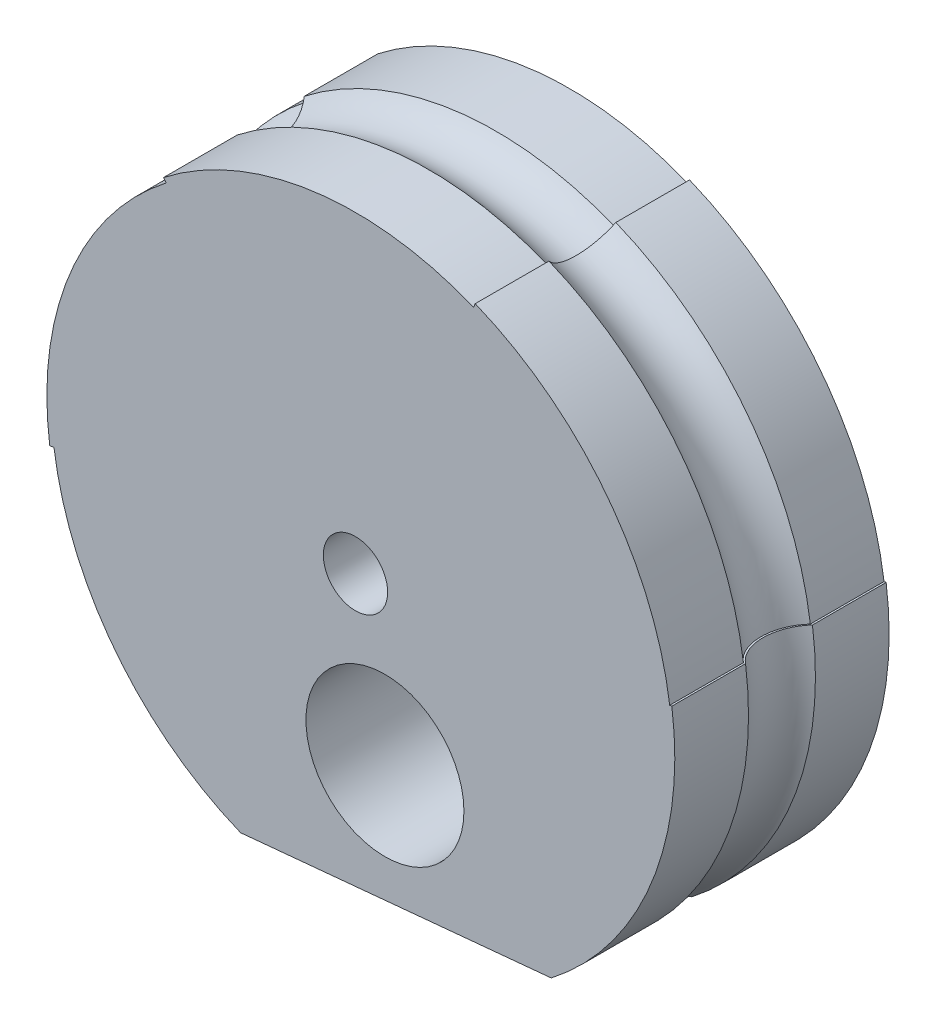
ISO-10303-21;
HEADER;
FILE_DESCRIPTION(('STEP AP214'),'2;1');
FILE_NAME('part.step','',(''),(''),'','','');
FILE_SCHEMA(('AUTOMOTIVE_DESIGN { 1 0 10303 214 1 1 1 1 }'));
ENDSEC;
DATA;
#1=APPLICATION_CONTEXT('core data for automotive mechanical design processes');
#2=APPLICATION_PROTOCOL_DEFINITION('international standard','automotive_design',2000,#1);
#3=PRODUCT_CONTEXT('',#1,'mechanical');
#4=PRODUCT('Part','Part','',(#3));
#5=PRODUCT_RELATED_PRODUCT_CATEGORY('part','',(#4));
#6=PRODUCT_DEFINITION_FORMATION('','',#4);
#7=PRODUCT_DEFINITION_CONTEXT('part definition',#1,'design');
#8=PRODUCT_DEFINITION('design','',#6,#7);
#9=PRODUCT_DEFINITION_SHAPE('','',#8);
#10=(LENGTH_UNIT() NAMED_UNIT(*) SI_UNIT(.MILLI.,.METRE.));
#11=(NAMED_UNIT(*) PLANE_ANGLE_UNIT() SI_UNIT($,.RADIAN.));
#12=(NAMED_UNIT(*) SI_UNIT($,.STERADIAN.) SOLID_ANGLE_UNIT());
#13=UNCERTAINTY_MEASURE_WITH_UNIT(LENGTH_MEASURE(1.E-05),#10,'distance_accuracy_value','');
#14=(GEOMETRIC_REPRESENTATION_CONTEXT(3) GLOBAL_UNCERTAINTY_ASSIGNED_CONTEXT((#13)) GLOBAL_UNIT_ASSIGNED_CONTEXT((#10,
#11,#12)) REPRESENTATION_CONTEXT('',''));
#15=CARTESIAN_POINT('',(0.,0.,0.));
#16=DIRECTION('',(0.,0.,1.));
#17=DIRECTION('',(1.,0.,0.));
#18=AXIS2_PLACEMENT_3D('',#15,#16,#17);
#19=CARTESIAN_POINT('',(54.8519790874451,15.7000000000002,-10.));
#20=DIRECTION('',(0.,0.,1.));
#21=DIRECTION('',(1.,0.,0.));
#22=AXIS2_PLACEMENT_3D('',#19,#20,#21);
#23=CYLINDRICAL_SURFACE('',#22,14.2);
#24=CARTESIAN_POINT('',(54.8519790874451,15.7000000000002,-6.56124949959959));
#25=DIRECTION('',(0.,0.,1.));
#26=DIRECTION('',(1.,0.,0.));
#27=AXIS2_PLACEMENT_3D('',#24,#25,#26);
#28=CIRCLE('',#27,14.2);
#29=CARTESIAN_POINT('',(40.7840275568936,13.7679700483551,-6.5612494995996));
#30=VERTEX_POINT('',#29);
#31=CARTESIAN_POINT('',(49.4911903411651,2.55078161951244,-6.5612494995996));
#32=VERTEX_POINT('',#31);
#33=EDGE_CURVE('E357',#30,#32,#28,.T.);
#34=ORIENTED_EDGE('',*,*,#33,.F.);
#35=DIRECTION('',(0.,0.,1.));
#36=VECTOR('',#35,1.);
#37=CARTESIAN_POINT('',(40.7840275568934,13.7679700483566,-10.));
#38=LINE('',#37,#36);
#39=CARTESIAN_POINT('',(40.7840275568934,13.7679700483566,-10.));
#40=VERTEX_POINT('',#39);
#41=EDGE_CURVE('E49',#40,#30,#38,.T.);
#42=ORIENTED_EDGE('',*,*,#41,.F.);
#43=CARTESIAN_POINT('',(54.8519790874451,15.7000000000002,-10.));
#44=DIRECTION('',(0.,0.,1.));
#45=DIRECTION('',(1.,0.,0.));
#46=AXIS2_PLACEMENT_3D('',#43,#44,#45);
#47=CIRCLE('',#46,14.2);
#48=CARTESIAN_POINT('',(49.4911903411651,2.55078161951245,-10.));
#49=VERTEX_POINT('',#48);
#50=EDGE_CURVE('E206',#40,#49,#47,.T.);
#51=ORIENTED_EDGE('',*,*,#50,.T.);
#52=DIRECTION('',(0.,0.,1.));
#53=VECTOR('',#52,1.);
#54=CARTESIAN_POINT('',(49.4911903411651,2.55078161951245,-10.));
#55=LINE('',#54,#53);
#56=EDGE_CURVE('E113',#49,#32,#55,.T.);
#57=ORIENTED_EDGE('',*,*,#56,.T.);
#58=EDGE_LOOP('',(#34,#42,#51,#57));
#59=FACE_BOUND('',#58,.T.);
#60=ADVANCED_FACE('F37',(#59),#23,.T.);
#61=CARTESIAN_POINT('',(54.8519790874451,15.7000000000002,-10.));
#62=DIRECTION('',(0.,0.,1.));
#63=DIRECTION('',(1.,0.,0.));
#64=AXIS2_PLACEMENT_3D('',#61,#62,#63);
#65=CYLINDRICAL_SURFACE('',#64,14.4);
#66=CARTESIAN_POINT('',(54.8519790874451,15.7000000000002,-3.43875050040039));
#67=DIRECTION('',(0.,0.,-1.));
#68=DIRECTION('',(-1.,0.,0.));
#69=AXIS2_PLACEMENT_3D('',#66,#67,#68);
#70=CIRCLE('',#69,14.4);
#71=CARTESIAN_POINT('',(40.5858873944915,13.7407583588954,-3.43875050040039));
#72=VERTEX_POINT('',#71);
#73=CARTESIAN_POINT('',(46.0221802076209,27.0751769982652,-3.43875050040039));
#74=VERTEX_POINT('',#73);
#75=EDGE_CURVE('E258',#72,#74,#70,.T.);
#76=ORIENTED_EDGE('',*,*,#75,.F.);
#77=DIRECTION('',(0.,0.,1.));
#78=VECTOR('',#77,1.);
#79=CARTESIAN_POINT('',(40.5858873944913,13.7407583588968,-10.));
#80=LINE('',#79,#78);
#81=CARTESIAN_POINT('',(40.5858873944913,13.7407583588968,0.));
#82=VERTEX_POINT('',#81);
#83=EDGE_CURVE('E151',#72,#82,#80,.T.);
#84=ORIENTED_EDGE('',*,*,#83,.T.);
#85=CARTESIAN_POINT('',(54.8519790874451,15.7000000000002,0.));
#86=DIRECTION('',(0.,0.,1.));
#87=DIRECTION('',(1.,0.,0.));
#88=AXIS2_PLACEMENT_3D('',#85,#86,#87);
#89=CIRCLE('',#88,14.4);
#90=CARTESIAN_POINT('',(46.0221802076203,27.0751769982647,0.));
#91=VERTEX_POINT('',#90);
#92=EDGE_CURVE('E200',#91,#82,#89,.T.);
#93=ORIENTED_EDGE('',*,*,#92,.F.);
#94=DIRECTION('',(0.,0.,1.));
#95=VECTOR('',#94,1.);
#96=CARTESIAN_POINT('',(46.0221802076203,27.0751769982647,-10.));
#97=LINE('',#96,#95);
#98=EDGE_CURVE('E152',#74,#91,#97,.T.);
#99=ORIENTED_EDGE('',*,*,#98,.F.);
#100=EDGE_LOOP('',(#76,#84,#93,#99));
#101=FACE_BOUND('',#100,.T.);
#102=ADVANCED_FACE('F255',(#101),#65,.T.);
#103=CARTESIAN_POINT('',(54.8519790874451,15.7000000000002,-10.));
#104=DIRECTION('',(0.,0.,1.));
#105=DIRECTION('',(1.,0.,0.));
#106=AXIS2_PLACEMENT_3D('',#103,#104,#105);
#107=CYLINDRICAL_SURFACE('',#106,14.6);
#108=CARTESIAN_POINT('',(54.8519790874451,15.7000000000002,-3.4387505004004));
#109=DIRECTION('',(0.,0.,-1.));
#110=DIRECTION('',(-1.,0.,0.));
#111=AXIS2_PLACEMENT_3D('',#108,#109,#110);
#112=CIRCLE('',#111,14.6);
#113=CARTESIAN_POINT('',(45.8995441120675,27.2331655676853,-3.4387505004004));
#114=VERTEX_POINT('',#113);
#115=CARTESIAN_POINT('',(60.3637759674218,29.2196188982488,-3.4387505004004));
#116=VERTEX_POINT('',#115);
#117=EDGE_CURVE('E276',#114,#116,#112,.T.);
#118=ORIENTED_EDGE('',*,*,#117,.F.);
#119=DIRECTION('',(0.,0.,1.));
#120=VECTOR('',#119,1.);
#121=CARTESIAN_POINT('',(45.8995441120672,27.233165567685,-10.));
#122=LINE('',#121,#120);
#123=CARTESIAN_POINT('',(45.8995441120672,27.233165567685,0.));
#124=VERTEX_POINT('',#123);
#125=EDGE_CURVE('E211',#114,#124,#122,.T.);
#126=ORIENTED_EDGE('',*,*,#125,.T.);
#127=CARTESIAN_POINT('',(54.8519790874451,15.7000000000002,0.));
#128=DIRECTION('',(0.,0.,1.));
#129=DIRECTION('',(1.,0.,0.));
#130=AXIS2_PLACEMENT_3D('',#127,#128,#129);
#131=CIRCLE('',#130,14.6);
#132=CARTESIAN_POINT('',(60.3637759674232,29.2196188982482,0.));
#133=VERTEX_POINT('',#132);
#134=EDGE_CURVE('E194',#133,#124,#131,.T.);
#135=ORIENTED_EDGE('',*,*,#134,.F.);
#136=DIRECTION('',(0.,0.,1.));
#137=VECTOR('',#136,1.);
#138=CARTESIAN_POINT('',(60.3637759674232,29.2196188982482,-10.));
#139=LINE('',#138,#137);
#140=EDGE_CURVE('E215',#116,#133,#139,.T.);
#141=ORIENTED_EDGE('',*,*,#140,.F.);
#142=EDGE_LOOP('',(#118,#126,#135,#141));
#143=FACE_BOUND('',#142,.T.);
#144=ADVANCED_FACE('F362',(#143),#107,.T.);
#145=CARTESIAN_POINT('',(54.8519790874451,15.7000000000002,-10.));
#146=DIRECTION('',(0.,0.,1.));
#147=DIRECTION('',(1.,0.,0.));
#148=AXIS2_PLACEMENT_3D('',#145,#146,#147);
#149=CYLINDRICAL_SURFACE('',#148,14.8);
#150=CARTESIAN_POINT('',(54.8519790874451,15.7000000000002,-3.43875050040041));
#151=DIRECTION('',(0.,0.,-1.));
#152=DIRECTION('',(-1.,0.,0.));
#153=AXIS2_PLACEMENT_3D('',#150,#151,#152);
#154=CIRCLE('',#153,14.8);
#155=CARTESIAN_POINT('',(60.4392800342737,29.4048191571277,-3.4387505004004));
#156=VERTEX_POINT('',#155);
#157=CARTESIAN_POINT('',(69.5143511052038,17.713665020019,-3.43875050040041));
#158=VERTEX_POINT('',#157);
#159=EDGE_CURVE('E288',#156,#158,#154,.T.);
#160=ORIENTED_EDGE('',*,*,#159,.F.);
#161=DIRECTION('',(0.,0.,1.));
#162=VECTOR('',#161,1.);
#163=CARTESIAN_POINT('',(60.4392800342721,29.4048191571283,-10.));
#164=LINE('',#163,#162);
#165=CARTESIAN_POINT('',(60.4392800342721,29.4048191571283,0.));
#166=VERTEX_POINT('',#165);
#167=EDGE_CURVE('E219',#156,#166,#164,.T.);
#168=ORIENTED_EDGE('',*,*,#167,.T.);
#169=CARTESIAN_POINT('',(54.8519790874451,15.7000000000002,0.));
#170=DIRECTION('',(0.,0.,1.));
#171=DIRECTION('',(1.,0.,0.));
#172=AXIS2_PLACEMENT_3D('',#169,#170,#171);
#173=CIRCLE('',#172,14.8);
#174=CARTESIAN_POINT('',(69.5143511052032,17.7136650200232,0.));
#175=VERTEX_POINT('',#174);
#176=EDGE_CURVE('E188',#175,#166,#173,.T.);
#177=ORIENTED_EDGE('',*,*,#176,.F.);
#178=DIRECTION('',(0.,0.,1.));
#179=VECTOR('',#178,1.);
#180=CARTESIAN_POINT('',(69.5143511052032,17.7136650200232,-10.));
#181=LINE('',#180,#179);
#182=EDGE_CURVE('E223',#158,#175,#181,.T.);
#183=ORIENTED_EDGE('',*,*,#182,.F.);
#184=EDGE_LOOP('',(#160,#168,#177,#183));
#185=FACE_BOUND('',#184,.T.);
#186=ADVANCED_FACE('F371',(#185),#149,.T.);
#187=CARTESIAN_POINT('',(54.8519790874451,15.7000000000002,-10.));
#188=DIRECTION('',(0.,0.,1.));
#189=DIRECTION('',(1.,0.,0.));
#190=AXIS2_PLACEMENT_3D('',#187,#188,#189);
#191=CYLINDRICAL_SURFACE('',#190,14.9);
#192=CARTESIAN_POINT('',(54.8519790874451,15.7000000000002,-3.4387505004004));
#193=DIRECTION('',(0.,0.,-1.));
#194=DIRECTION('',(-1.,0.,0.));
#195=AXIS2_PLACEMENT_3D('',#192,#193,#194);
#196=CIRCLE('',#195,14.9);
#197=CARTESIAN_POINT('',(69.6134211864049,17.7272708647482,-3.4387505004004));
#198=VERTEX_POINT('',#197);
#199=CARTESIAN_POINT('',(63.9883682061527,3.92985157818493,-3.43875050040037));
#200=VERTEX_POINT('',#199);
#201=EDGE_CURVE('E55',#198,#200,#196,.T.);
#202=ORIENTED_EDGE('',*,*,#201,.F.);
#203=DIRECTION('',(0.,0.,1.));
#204=VECTOR('',#203,1.);
#205=CARTESIAN_POINT('',(69.6134211864043,17.7272708647531,-10.));
#206=LINE('',#205,#204);
#207=CARTESIAN_POINT('',(69.6134211864043,17.7272708647531,0.));
#208=VERTEX_POINT('',#207);
#209=EDGE_CURVE('E227',#198,#208,#206,.T.);
#210=ORIENTED_EDGE('',*,*,#209,.T.);
#211=CARTESIAN_POINT('',(54.8519790874451,15.7000000000002,0.));
#212=DIRECTION('',(0.,0.,1.));
#213=DIRECTION('',(1.,0.,0.));
#214=AXIS2_PLACEMENT_3D('',#211,#212,#213);
#215=CIRCLE('',#214,14.9);
#216=CARTESIAN_POINT('',(63.9883682061527,3.92985157818493,0.));
#217=VERTEX_POINT('',#216);
#218=EDGE_CURVE('E182',#217,#208,#215,.T.);
#219=ORIENTED_EDGE('',*,*,#218,.F.);
#220=DIRECTION('',(0.,0.,1.));
#221=VECTOR('',#220,1.);
#222=CARTESIAN_POINT('',(63.9883682061527,3.92985157818493,-10.));
#223=LINE('',#222,#221);
#224=EDGE_CURVE('E230',#200,#217,#223,.T.);
#225=ORIENTED_EDGE('',*,*,#224,.F.);
#226=EDGE_LOOP('',(#202,#210,#219,#225));
#227=FACE_BOUND('',#226,.T.);
#228=ADVANCED_FACE('F365',(#227),#191,.T.);
#229=CARTESIAN_POINT('',(54.8519790874451,15.7000000000002,-3.4387505004004));
#230=DIRECTION('',(0.,0.,-1.));
#231=DIRECTION('',(-1.,0.,0.));
#232=AXIS2_PLACEMENT_3D('',#229,#230,#231);
#233=CIRCLE('',#232,14.2);
#234=CARTESIAN_POINT('',(49.491190341147,2.55078161951072,-3.43875050039367));
#235=VERTEX_POINT('',#234);
#236=CARTESIAN_POINT('',(40.7840275568936,13.7679700483551,-3.4387505004004));
#237=VERTEX_POINT('',#236);
#238=EDGE_CURVE('E238',#235,#237,#233,.T.);
#239=ORIENTED_EDGE('',*,*,#238,.F.);
#240=CARTESIAN_POINT('',(49.4911903411651,2.55078161951245,0.));
#241=VERTEX_POINT('',#240);
#242=EDGE_CURVE('E174',#235,#241,#55,.T.);
#243=ORIENTED_EDGE('',*,*,#242,.T.);
#244=CARTESIAN_POINT('',(54.8519790874451,15.7000000000002,0.));
#245=DIRECTION('',(0.,0.,1.));
#246=DIRECTION('',(1.,0.,0.));
#247=AXIS2_PLACEMENT_3D('',#244,#245,#246);
#248=CIRCLE('',#247,14.2);
#249=CARTESIAN_POINT('',(40.7840275568934,13.7679700483566,0.));
#250=VERTEX_POINT('',#249);
#251=EDGE_CURVE('E175',#250,#241,#248,.T.);
#252=ORIENTED_EDGE('',*,*,#251,.F.);
#253=EDGE_CURVE('E104',#237,#250,#38,.T.);
#254=ORIENTED_EDGE('',*,*,#253,.F.);
#255=EDGE_LOOP('',(#239,#243,#252,#254));
#256=FACE_BOUND('',#255,.T.);
#257=ADVANCED_FACE('F39',(#256),#23,.T.);
#258=CARTESIAN_POINT('',(40.5858873944913,13.7407583588968,-10.));
#259=DIRECTION('',(0.136058447298851,-0.990700812010683,0.));
#260=DIRECTION('',(0.990700812010683,0.136058447298851,0.));
#261=AXIS2_PLACEMENT_3D('',#258,#259,#260);
#262=PLANE('',#261);
#263=ORIENTED_EDGE('',*,*,#41,.T.);
#264=CARTESIAN_POINT('',(39.5456515418802,13.5978969892316,-5.));
#265=DIRECTION('',(-0.136058447298817,0.990700812010687,0.));
#266=DIRECTION('',(-0.990700812010687,-0.136058447298817,0.));
#267=AXIS2_PLACEMENT_3D('',#264,#265,#266);
#268=CIRCLE('',#267,1.99999999999999);
#269=EDGE_CURVE('E436',#237,#30,#268,.T.);
#270=ORIENTED_EDGE('',*,*,#269,.F.);
#271=ORIENTED_EDGE('',*,*,#253,.T.);
#272=DIRECTION('',(0.990700812010683,0.136058447298851,0.));
#273=VECTOR('',#272,1.);
#274=CARTESIAN_POINT('',(40.5858873944913,13.7407583588968,0.));
#275=LINE('',#274,#273);
#276=EDGE_CURVE('E203',#82,#250,#275,.T.);
#277=ORIENTED_EDGE('',*,*,#276,.F.);
#278=ORIENTED_EDGE('',*,*,#83,.F.);
#279=CARTESIAN_POINT('',(39.3475113794781,13.5706852997718,-5.));
#280=DIRECTION('',(0.136058447298817,-0.990700812010687,0.));
#281=DIRECTION('',(0.990700812010687,0.136058447298817,0.));
#282=AXIS2_PLACEMENT_3D('',#279,#280,#281);
#283=CIRCLE('',#282,2.);
#284=CARTESIAN_POINT('',(40.5858873944915,13.7407583588954,-6.56124949959961));
#285=VERTEX_POINT('',#284);
#286=EDGE_CURVE('E251',#285,#72,#283,.T.);
#287=ORIENTED_EDGE('',*,*,#286,.F.);
#288=CARTESIAN_POINT('',(40.5858873944913,13.7407583588968,-10.));
#289=VERTEX_POINT('',#288);
#290=EDGE_CURVE('E208',#289,#285,#80,.T.);
#291=ORIENTED_EDGE('',*,*,#290,.F.);
#292=DIRECTION('',(0.990700812010683,0.136058447298851,0.));
#293=VECTOR('',#292,1.);
#294=CARTESIAN_POINT('',(40.5858873944913,13.7407583588968,-10.));
#295=LINE('',#294,#293);
#296=EDGE_CURVE('E161',#289,#40,#295,.T.);
#297=ORIENTED_EDGE('',*,*,#296,.T.);
#298=EDGE_LOOP('',(#263,#270,#271,#277,#278,#287,#291,#297));
#299=FACE_BOUND('',#298,.T.);
#300=ADVANCED_FACE('F246',(#299),#262,.T.);
#301=CARTESIAN_POINT('',(54.8519790874451,15.7000000000002,-6.56124949959961));
#302=DIRECTION('',(0.,0.,1.));
#303=DIRECTION('',(1.,0.,0.));
#304=AXIS2_PLACEMENT_3D('',#301,#302,#303);
#305=CIRCLE('',#304,14.4);
#306=CARTESIAN_POINT('',(46.0221802076209,27.0751769982652,-6.56124949959961));
#307=VERTEX_POINT('',#306);
#308=EDGE_CURVE('E147',#307,#285,#305,.T.);
#309=ORIENTED_EDGE('',*,*,#308,.F.);
#310=CARTESIAN_POINT('',(46.0221802076203,27.0751769982647,-10.));
#311=VERTEX_POINT('',#310);
#312=EDGE_CURVE('E139',#311,#307,#97,.T.);
#313=ORIENTED_EDGE('',*,*,#312,.F.);
#314=CARTESIAN_POINT('',(54.8519790874451,15.7000000000002,-10.));
#315=DIRECTION('',(0.,0.,1.));
#316=DIRECTION('',(1.,0.,0.));
#317=AXIS2_PLACEMENT_3D('',#314,#315,#316);
#318=CIRCLE('',#317,14.4);
#319=EDGE_CURVE('E143',#311,#289,#318,.T.);
#320=ORIENTED_EDGE('',*,*,#319,.T.);
#321=ORIENTED_EDGE('',*,*,#290,.T.);
#322=EDGE_LOOP('',(#309,#313,#320,#321));
#323=FACE_BOUND('',#322,.T.);
#324=ADVANCED_FACE('F141',(#323),#65,.T.);
#325=CARTESIAN_POINT('',(45.8995441120672,27.233165567685,-10.));
#326=DIRECTION('',(-0.78994284710174,-0.613180477765557,0.));
#327=DIRECTION('',(0.613180477765557,-0.78994284710174,0.));
#328=AXIS2_PLACEMENT_3D('',#325,#326,#327);
#329=PLANE('',#328);
#330=ORIENTED_EDGE('',*,*,#312,.T.);
#331=CARTESIAN_POINT('',(45.2557046104141,28.0626055571424,-5.));
#332=DIRECTION('',(-0.789942847101814,-0.613180477765462,0.));
#333=DIRECTION('',(0.613180477765462,-0.789942847101814,0.));
#334=AXIS2_PLACEMENT_3D('',#331,#332,#333);
#335=CIRCLE('',#334,2.);
#336=EDGE_CURVE('E267',#307,#74,#335,.T.);
#337=ORIENTED_EDGE('',*,*,#336,.T.);
#338=ORIENTED_EDGE('',*,*,#98,.T.);
#339=DIRECTION('',(0.613180477765557,-0.78994284710174,0.));
#340=VECTOR('',#339,1.);
#341=CARTESIAN_POINT('',(45.8995441120672,27.233165567685,0.));
#342=LINE('',#341,#340);
#343=EDGE_CURVE('E197',#124,#91,#342,.T.);
#344=ORIENTED_EDGE('',*,*,#343,.F.);
#345=ORIENTED_EDGE('',*,*,#125,.F.);
#346=CARTESIAN_POINT('',(45.1330685148605,28.2205941265624,-5.));
#347=DIRECTION('',(-0.789942847101703,-0.613180477765604,0.));
#348=DIRECTION('',(0.613180477765604,-0.789942847101704,0.));
#349=AXIS2_PLACEMENT_3D('',#346,#347,#348);
#350=CIRCLE('',#349,2.);
#351=CARTESIAN_POINT('',(45.8995441120675,27.2331655676853,-6.56124949959959));
#352=VERTEX_POINT('',#351);
#353=EDGE_CURVE('E262',#352,#114,#350,.T.);
#354=ORIENTED_EDGE('',*,*,#353,.F.);
#355=CARTESIAN_POINT('',(45.8995441120672,27.233165567685,-10.));
#356=VERTEX_POINT('',#355);
#357=EDGE_CURVE('E166',#356,#352,#122,.T.);
#358=ORIENTED_EDGE('',*,*,#357,.F.);
#359=DIRECTION('',(0.613180477765557,-0.78994284710174,0.));
#360=VECTOR('',#359,1.);
#361=CARTESIAN_POINT('',(45.8995441120672,27.233165567685,-10.));
#362=LINE('',#361,#360);
#363=EDGE_CURVE('E158',#356,#311,#362,.T.);
#364=ORIENTED_EDGE('',*,*,#363,.T.);
#365=EDGE_LOOP('',(#330,#337,#338,#344,#345,#354,#358,#364));
#366=FACE_BOUND('',#365,.T.);
#367=ADVANCED_FACE('F163',(#366),#329,.T.);
#368=CARTESIAN_POINT('',(54.8519790874451,15.7000000000002,-6.56124949959959));
#369=DIRECTION('',(0.,0.,1.));
#370=DIRECTION('',(1.,0.,0.));
#371=AXIS2_PLACEMENT_3D('',#368,#369,#370);
#372=CIRCLE('',#371,14.6);
#373=CARTESIAN_POINT('',(60.3637759674218,29.2196188982488,-6.5612494995996));
#374=VERTEX_POINT('',#373);
#375=EDGE_CURVE('E273',#374,#352,#372,.T.);
#376=ORIENTED_EDGE('',*,*,#375,.F.);
#377=CARTESIAN_POINT('',(60.3637759674232,29.2196188982482,-10.));
#378=VERTEX_POINT('',#377);
#379=EDGE_CURVE('E212',#378,#374,#139,.T.);
#380=ORIENTED_EDGE('',*,*,#379,.F.);
#381=CARTESIAN_POINT('',(54.8519790874451,15.7000000000002,-10.));
#382=DIRECTION('',(0.,0.,1.));
#383=DIRECTION('',(1.,0.,0.));
#384=AXIS2_PLACEMENT_3D('',#381,#382,#383);
#385=CIRCLE('',#384,14.6);
#386=EDGE_CURVE('E167',#378,#356,#385,.T.);
#387=ORIENTED_EDGE('',*,*,#386,.T.);
#388=ORIENTED_EDGE('',*,*,#357,.T.);
#389=EDGE_LOOP('',(#376,#380,#387,#388));
#390=FACE_BOUND('',#389,.T.);
#391=ADVANCED_FACE('F391',(#390),#107,.T.);
#392=CARTESIAN_POINT('',(60.4392800342721,29.4048191571283,-10.));
#393=DIRECTION('',(-0.926001294400584,0.377520334244981,0.));
#394=DIRECTION('',(-0.377520334244981,-0.926001294400584,0.));
#395=AXIS2_PLACEMENT_3D('',#392,#393,#394);
#396=PLANE('',#395);
#397=ORIENTED_EDGE('',*,*,#379,.T.);
#398=CARTESIAN_POINT('',(60.8356763852281,30.3771205162495,-5.));
#399=DIRECTION('',(-0.926001294400584,0.377520334244981,0.));
#400=DIRECTION('',(-0.377520334244981,-0.926001294400584,0.));
#401=AXIS2_PLACEMENT_3D('',#398,#399,#400);
#402=CIRCLE('',#401,2.);
#403=EDGE_CURVE('E265',#116,#374,#402,.F.);
#404=ORIENTED_EDGE('',*,*,#403,.F.);
#405=ORIENTED_EDGE('',*,*,#140,.T.);
#406=DIRECTION('',(-0.377520334244982,-0.926001294400584,0.));
#407=VECTOR('',#406,1.);
#408=CARTESIAN_POINT('',(60.4392800342721,29.4048191571283,0.));
#409=LINE('',#408,#407);
#410=EDGE_CURVE('E191',#166,#133,#409,.T.);
#411=ORIENTED_EDGE('',*,*,#410,.F.);
#412=ORIENTED_EDGE('',*,*,#167,.F.);
#413=CARTESIAN_POINT('',(60.9111804520799,30.5623207751285,-5.));
#414=DIRECTION('',(-0.926001294400572,0.377520334245011,0.));
#415=DIRECTION('',(-0.377520334245011,-0.926001294400572,0.));
#416=AXIS2_PLACEMENT_3D('',#413,#414,#415);
#417=CIRCLE('',#416,2.00000000000001);
#418=CARTESIAN_POINT('',(60.4392800342737,29.4048191571277,-6.5612494995996));
#419=VERTEX_POINT('',#418);
#420=EDGE_CURVE('E279',#419,#156,#417,.T.);
#421=ORIENTED_EDGE('',*,*,#420,.F.);
#422=CARTESIAN_POINT('',(60.4392800342721,29.4048191571283,-10.));
#423=VERTEX_POINT('',#422);
#424=EDGE_CURVE('E216',#423,#419,#164,.T.);
#425=ORIENTED_EDGE('',*,*,#424,.F.);
#426=DIRECTION('',(-0.377520334244982,-0.926001294400584,0.));
#427=VECTOR('',#426,1.);
#428=CARTESIAN_POINT('',(60.4392800342721,29.4048191571283,-10.));
#429=LINE('',#428,#427);
#430=EDGE_CURVE('E169',#423,#378,#429,.T.);
#431=ORIENTED_EDGE('',*,*,#430,.T.);
#432=EDGE_LOOP('',(#397,#404,#405,#411,#412,#421,#425,#431));
#433=FACE_BOUND('',#432,.T.);
#434=ADVANCED_FACE('F322',(#433),#396,.T.);
#435=CARTESIAN_POINT('',(54.8519790874451,15.7000000000002,-6.56124949959959));
#436=DIRECTION('',(0.,0.,1.));
#437=DIRECTION('',(1.,0.,0.));
#438=AXIS2_PLACEMENT_3D('',#435,#436,#437);
#439=CIRCLE('',#438,14.8);
#440=CARTESIAN_POINT('',(69.5143511052038,17.713665020019,-6.56124949959959));
#441=VERTEX_POINT('',#440);
#442=EDGE_CURVE('E285',#441,#419,#439,.T.);
#443=ORIENTED_EDGE('',*,*,#442,.F.);
#444=CARTESIAN_POINT('',(69.5143511052032,17.7136650200232,-10.));
#445=VERTEX_POINT('',#444);
#446=EDGE_CURVE('E220',#445,#441,#181,.T.);
#447=ORIENTED_EDGE('',*,*,#446,.F.);
#448=CARTESIAN_POINT('',(54.8519790874451,15.7000000000002,-10.));
#449=DIRECTION('',(0.,0.,1.));
#450=DIRECTION('',(1.,0.,0.));
#451=AXIS2_PLACEMENT_3D('',#448,#449,#450);
#452=CIRCLE('',#451,14.8);
#453=EDGE_CURVE('E317',#445,#423,#452,.T.);
#454=ORIENTED_EDGE('',*,*,#453,.T.);
#455=ORIENTED_EDGE('',*,*,#424,.T.);
#456=EDGE_LOOP('',(#443,#447,#454,#455));
#457=FACE_BOUND('',#456,.T.);
#458=ADVANCED_FACE('F330',(#457),#149,.T.);
#459=CARTESIAN_POINT('',(69.6134211864043,17.7272708647531,-10.));
#460=DIRECTION('',(-0.136058447298834,0.990700812010685,0.));
#461=DIRECTION('',(-0.990700812010685,-0.136058447298834,0.));
#462=AXIS2_PLACEMENT_3D('',#459,#460,#461);
#463=PLANE('',#462);
#464=ORIENTED_EDGE('',*,*,#446,.T.);
#465=CARTESIAN_POINT('',(70.7527271202172,17.8837380791424,-5.));
#466=DIRECTION('',(-0.136058447298735,0.990700812010699,0.));
#467=DIRECTION('',(-0.990700812010699,-0.136058447298735,0.));
#468=AXIS2_PLACEMENT_3D('',#465,#466,#467);
#469=CIRCLE('',#468,2.00000000000001);
#470=EDGE_CURVE('E282',#441,#158,#469,.T.);
#471=ORIENTED_EDGE('',*,*,#470,.T.);
#472=ORIENTED_EDGE('',*,*,#182,.T.);
#473=DIRECTION('',(-0.990700812010685,-0.136058447298834,0.));
#474=VECTOR('',#473,1.);
#475=CARTESIAN_POINT('',(69.6134211864043,17.7272708647531,0.));
#476=LINE('',#475,#474);
#477=EDGE_CURVE('E185',#208,#175,#476,.T.);
#478=ORIENTED_EDGE('',*,*,#477,.F.);
#479=ORIENTED_EDGE('',*,*,#209,.F.);
#480=CARTESIAN_POINT('',(70.8517972014183,17.8973439238717,-4.99999999999997));
#481=DIRECTION('',(-0.136058447298766,0.990700812010694,0.));
#482=DIRECTION('',(-0.990700812010694,-0.136058447298766,0.));
#483=AXIS2_PLACEMENT_3D('',#480,#481,#482);
#484=CIRCLE('',#483,2.);
#485=CARTESIAN_POINT('',(69.6134211864049,17.7272708647482,-6.56124949959955));
#486=VERTEX_POINT('',#485);
#487=EDGE_CURVE('E291',#486,#198,#484,.T.);
#488=ORIENTED_EDGE('',*,*,#487,.F.);
#489=CARTESIAN_POINT('',(69.6134211864043,17.7272708647531,-10.));
#490=VERTEX_POINT('',#489);
#491=EDGE_CURVE('E224',#490,#486,#206,.T.);
#492=ORIENTED_EDGE('',*,*,#491,.F.);
#493=DIRECTION('',(-0.990700812010685,-0.136058447298834,0.));
#494=VECTOR('',#493,1.);
#495=CARTESIAN_POINT('',(69.6134211864043,17.7272708647531,-10.));
#496=LINE('',#495,#494);
#497=EDGE_CURVE('E314',#490,#445,#496,.T.);
#498=ORIENTED_EDGE('',*,*,#497,.T.);
#499=EDGE_LOOP('',(#464,#471,#472,#478,#479,#488,#492,#498));
#500=FACE_BOUND('',#499,.T.);
#501=ADVANCED_FACE('F334',(#500),#463,.T.);
#502=CARTESIAN_POINT('',(54.8519790874451,15.7000000000002,-6.56124949959955));
#503=DIRECTION('',(0.,0.,1.));
#504=DIRECTION('',(1.,0.,0.));
#505=AXIS2_PLACEMENT_3D('',#502,#503,#504);
#506=CIRCLE('',#505,14.9);
#507=CARTESIAN_POINT('',(63.9883682061706,3.92985157818663,-6.56124949960725));
#508=VERTEX_POINT('',#507);
#509=EDGE_CURVE('E293',#508,#486,#506,.T.);
#510=ORIENTED_EDGE('',*,*,#509,.F.);
#511=CARTESIAN_POINT('',(63.9883682061527,3.92985157818493,-10.));
#512=VERTEX_POINT('',#511);
#513=EDGE_CURVE('E228',#512,#508,#223,.T.);
#514=ORIENTED_EDGE('',*,*,#513,.F.);
#515=CARTESIAN_POINT('',(54.8519790874451,15.7000000000002,-10.));
#516=DIRECTION('',(0.,0.,1.));
#517=DIRECTION('',(1.,0.,0.));
#518=AXIS2_PLACEMENT_3D('',#515,#516,#517);
#519=CIRCLE('',#518,14.9);
#520=EDGE_CURVE('E311',#512,#490,#519,.T.);
#521=ORIENTED_EDGE('',*,*,#520,.T.);
#522=ORIENTED_EDGE('',*,*,#491,.T.);
#523=EDGE_LOOP('',(#510,#514,#521,#522));
#524=FACE_BOUND('',#523,.T.);
#525=ADVANCED_FACE('F353',(#524),#191,.T.);
#526=CARTESIAN_POINT('',(49.4911903411651,2.55078161951245,-10.));
#527=DIRECTION('',(0.0946992805991358,-0.995505924770921,0.));
#528=DIRECTION('',(0.995505924770921,0.0946992805991358,0.));
#529=AXIS2_PLACEMENT_3D('',#526,#527,#528);
#530=PLANE('',#529);
#531=CARTESIAN_POINT('',(44.0958587580909,2.03754105830886,-5.49249852241193));
#532=CARTESIAN_POINT('',(44.0681352699951,2.03490381194694,-5.41685775677946));
#533=CARTESIAN_POINT('',(44.0464765043102,2.03284348314528,-5.3389771784225));
#534=CARTESIAN_POINT('',(44.0166509308031,2.03000627215105,-5.18064214090047));
#535=CARTESIAN_POINT('',(44.0084772267152,2.02922873393888,-5.10018901880828));
#536=CARTESIAN_POINT('',(44.0062019254681,2.02901229184056,-4.93898804635471));
#537=CARTESIAN_POINT('',(44.0121168717432,2.02957496167818,-4.85823996078254));
#538=CARTESIAN_POINT('',(44.0376220706957,2.03200118932006,-4.6989632321824));
#539=CARTESIAN_POINT('',(44.0572158108606,2.03386507887781,-4.62043516047354));
#540=CARTESIAN_POINT('',(44.1083905224991,2.0387331647992,-4.46880457946176));
#541=CARTESIAN_POINT('',(44.1397858336276,2.04171969989063,-4.39563800431289));
#542=CARTESIAN_POINT('',(44.2128753564458,2.04867247139906,-4.25473988905121));
#543=CARTESIAN_POINT('',(44.2545735612197,2.05263908766532,-4.18701046972877));
#544=CARTESIAN_POINT('',(44.3669530901625,2.06332939123876,-4.02892484927515));
#545=CARTESIAN_POINT('',(44.4422784127992,2.0704948472015,-3.94189423070147));
#546=CARTESIAN_POINT('',(44.605902342234,2.08605986597308,-3.7811505208022));
#547=CARTESIAN_POINT('',(44.6942295878133,2.09446215309718,-3.70746765031898));
#548=CARTESIAN_POINT('',(44.9202618467511,2.11596387577003,-3.54378353989514));
#549=CARTESIAN_POINT('',(45.0627871507193,2.12952185007949,-3.46053099133183));
#550=CARTESIAN_POINT('',(45.3588731060589,2.15768755584626,-3.31738094079307));
#551=CARTESIAN_POINT('',(45.5124495932569,2.17229679371487,-3.25751777692984));
#552=CARTESIAN_POINT('',(45.7900837000155,2.19870723440197,-3.1694152510512));
#553=CARTESIAN_POINT('',(45.9128949093213,2.21038987021697,-3.13707831809804));
#554=CARTESIAN_POINT('',(46.1608897336265,2.23398082117933,-3.08322044181127));
#555=CARTESIAN_POINT('',(46.2860745863277,2.24588925406529,-3.06170531179921));
#556=CARTESIAN_POINT('',(46.5380249040882,2.26985647841319,-3.02838859161752));
#557=CARTESIAN_POINT('',(46.6647936717386,2.28191558404,-3.01661281933268));
#558=CARTESIAN_POINT('',(46.9188518490973,2.30608332230006,-3.00195325210442));
#559=CARTESIAN_POINT('',(47.0461414051191,2.31819196885163,-2.99907215646989));
#560=CARTESIAN_POINT('',(47.3638369480644,2.34841332526736,-3.00203437454578));
#561=CARTESIAN_POINT('',(47.554204572357,2.36652238581767,-3.0129190767547));
#562=CARTESIAN_POINT('',(47.9333814391277,2.40259226306254,-3.05097710635765));
#563=CARTESIAN_POINT('',(48.122189548397,2.42055297195857,-3.07816137487576));
#564=CARTESIAN_POINT('',(48.4963832663699,2.45614881826647,-3.14747643758231));
#565=CARTESIAN_POINT('',(48.6817783637214,2.47378485830293,-3.18955585297747));
#566=CARTESIAN_POINT('',(49.048607009407,2.50868008894415,-3.28815374429512));
#567=CARTESIAN_POINT('',(49.2300432788429,2.52593953839858,-3.34466193998133));
#568=CARTESIAN_POINT('',(49.5456994820418,2.55596689897554,-3.45765746021913));
#569=CARTESIAN_POINT('',(49.6810227042802,2.56883976238645,-3.51104807398433));
#570=CARTESIAN_POINT('',(49.9482333576486,2.59425865343749,-3.62777304060953));
#571=CARTESIAN_POINT('',(50.0801003101473,2.6068027330112,-3.69115561342278));
#572=CARTESIAN_POINT('',(50.2899729312618,2.62676724125013,-3.80386925902723));
#573=CARTESIAN_POINT('',(50.369836800347,2.63436443455661,-3.84970887686724));
#574=CARTESIAN_POINT('',(50.5263941317188,2.64925723055563,-3.94687951243974));
#575=CARTESIAN_POINT('',(50.6030828050756,2.65655237769267,-3.99821843400168));
#576=CARTESIAN_POINT('',(50.7510572049258,2.67062870698837,-4.10707447521309));
#577=CARTESIAN_POINT('',(50.8223826408123,2.67741366657405,-4.16453652687465));
#578=CARTESIAN_POINT('',(50.9575415186685,2.69027089643184,-4.2876311168179));
#579=CARTESIAN_POINT('',(51.0214008997459,2.69634563420794,-4.35323362907823));
#580=CARTESIAN_POINT('',(51.1150601267011,2.70525513559153,-4.46855055124427));
#581=CARTESIAN_POINT('',(51.1486883315901,2.70845407869332,-4.51508557571169));
#582=CARTESIAN_POINT('',(51.2086365153997,2.7141567568379,-4.61269148023746));
#583=CARTESIAN_POINT('',(51.2349753617438,2.71666228667809,-4.66375018994936));
#584=CARTESIAN_POINT('',(51.2718358479847,2.7201687063213,-4.75621241614162));
#585=CARTESIAN_POINT('',(51.2846907930061,2.72139155594517,-4.7966639548633));
#586=CARTESIAN_POINT('',(51.3035165461423,2.72318238936401,-4.87916381650771));
#587=CARTESIAN_POINT('',(51.3094940333165,2.72375100851644,-4.92121054918136));
#588=CARTESIAN_POINT('',(51.3138487764213,2.72416526123856,-5.00586790086789));
#589=CARTESIAN_POINT('',(51.3121980740064,2.72400823522064,-5.04848002251889));
#590=CARTESIAN_POINT('',(51.3014513424683,2.72298593317289,-5.13274247757341));
#591=CARTESIAN_POINT('',(51.2923494655942,2.72212010086529,-5.17439202913582));
#592=CARTESIAN_POINT('',(51.2646109555231,2.71948142551111,-5.26598379131298));
#593=CARTESIAN_POINT('',(51.2441444046107,2.71753450827082,-5.31535751129587));
#594=CARTESIAN_POINT('',(51.1956921764036,2.71292540345239,-5.41021970450619));
#595=CARTESIAN_POINT('',(51.1676881882848,2.71026147402438,-5.4556983559403));
#596=CARTESIAN_POINT('',(51.0839366568966,2.70229445989198,-5.57477059058657));
#597=CARTESIAN_POINT('',(51.022894661274,2.69648773094346,-5.64455074641553));
#598=CARTESIAN_POINT('',(50.8918938061943,2.68402604043491,-5.77497297630401));
#599=CARTESIAN_POINT('',(50.8219081377956,2.6773685286264,-5.83558632815959));
#600=CARTESIAN_POINT('',(50.6673144680233,2.66266252944715,-5.95680158778165));
#601=CARTESIAN_POINT('',(50.5819733310751,2.65454430124437,-6.01644906602809));
#602=CARTESIAN_POINT('',(50.4067437695402,2.63787527597375,-6.12865507385835));
#603=CARTESIAN_POINT('',(50.3168501653879,2.62932398619047,-6.18120526751439));
#604=CARTESIAN_POINT('',(50.133645538014,2.61189631852618,-6.28049946953286));
#605=CARTESIAN_POINT('',(50.0403258310198,2.60301911458577,-6.32722718498591));
#606=CARTESIAN_POINT('',(49.851324231702,2.58503999960301,-6.41544345543849));
#607=CARTESIAN_POINT('',(49.755643250597,2.57593817524195,-6.45693399481295));
#608=CARTESIAN_POINT('',(49.5675137331472,2.55804201860575,-6.53307440631844));
#609=CARTESIAN_POINT('',(49.4751636253445,2.54925704952164,-6.56797063190381));
#610=CARTESIAN_POINT('',(49.289041701293,2.53155186879611,-6.63371243387731));
#611=CARTESIAN_POINT('',(49.1952697005698,2.52263163960624,-6.66455747956805));
#612=CARTESIAN_POINT('',(48.9120262784828,2.49568760277165,-6.75123640144615));
#613=CARTESIAN_POINT('',(48.7207314179475,2.47749033721627,-6.80117252001869));
#614=CARTESIAN_POINT('',(48.3350050688798,2.44079742876046,-6.8851313009501));
#615=CARTESIAN_POINT('',(48.1405780584897,2.42230221185131,-6.91917490148077));
#616=CARTESIAN_POINT('',(47.749607683852,2.38511045608925,-6.97035186785543));
#617=CARTESIAN_POINT('',(47.5530660821337,2.36641408490009,-6.98749835756407));
#618=CARTESIAN_POINT('',(47.2334574962184,2.3360107468522,-7.00010581437883));
#619=CARTESIAN_POINT('',(47.1105995247915,2.32432366270684,-7.00130223815951));
#620=CARTESIAN_POINT('',(46.8650695810326,2.30096718791253,-6.99578575830486));
#621=CARTESIAN_POINT('',(46.7423975691302,2.28929779349935,-6.98907487979185));
#622=CARTESIAN_POINT('',(46.4979644854365,2.2660456594794,-6.9670181506239));
#623=CARTESIAN_POINT('',(46.3762024314912,2.25446282644348,-6.95168361361228));
#624=CARTESIAN_POINT('',(46.1342758405102,2.23144912702328,-6.9115072959515));
#625=CARTESIAN_POINT('',(46.014110738703,2.22001820691411,-6.88666897423853));
#626=CARTESIAN_POINT('',(45.7307901645536,2.19306683085167,-6.81490398919355));
#627=CARTESIAN_POINT('',(45.5687956078569,2.17765680907437,-6.76316104149017));
#628=CARTESIAN_POINT('',(45.2540776738949,2.14771870303577,-6.63627574014752));
#629=CARTESIAN_POINT('',(45.1013405338397,2.13318930956448,-6.56116919356687));
#630=CARTESIAN_POINT('',(44.8547167085668,2.10972877733578,-6.41028285855886));
#631=CARTESIAN_POINT('',(44.7567660253671,2.10041104350578,-6.34124492328756));
#632=CARTESIAN_POINT('',(44.5724918690666,2.08288163499052,-6.1888064462548));
#633=CARTESIAN_POINT('',(44.4861584200584,2.07466901132924,-6.1054183692624));
#634=CARTESIAN_POINT('',(44.3415522386347,2.06091308983217,-5.9375206407379));
#635=CARTESIAN_POINT('',(44.281018465102,2.05515470641842,-5.85499439914744));
#636=CARTESIAN_POINT('',(44.1757250384885,2.04513848099574,-5.68032851684213));
#637=CARTESIAN_POINT('',(44.130937169052,2.04087795485555,-5.58820645977892));
#638=CARTESIAN_POINT('',(44.0958587580909,2.03754105830886,-5.49249852241193));
#639=B_SPLINE_CURVE_WITH_KNOTS('',3,(#531,#532,#533,#534,#535,#536,#537,#538,#539,#540,#541,
#542,#543,#544,#545,#546,#547,#548,#549,#550,#551,#552,#553,#554,#555,#556,#557,#558,#559,#560,
#561,#562,#563,#564,#565,#566,#567,#568,#569,#570,#571,#572,#573,#574,#575,#576,#577,#578,#579,
#580,#581,#582,#583,#584,#585,#586,#587,#588,#589,#590,#591,#592,#593,#594,#595,#596,#597,#598,
#599,#600,#601,#602,#603,#604,#605,#606,#607,#608,#609,#610,#611,#612,#613,#614,#615,#616,#617,
#618,#619,#620,#621,#622,#623,#624,#625,#626,#627,#628,#629,#630,#631,#632,#633,#634,#635,#636,
#637,#638),.UNSPECIFIED.,.T.,.F.,(4,2,2,2,2,2,2,2,2,2,2,2,2,2,2,2,2,2,2,2,2,2,2,2,2,2,2,2,2,2,2,
2,2,2,2,2,2,2,2,2,2,2,2,2,2,2,2,2,2,2,2,2,2,4),(0.,0.241506290350475,0.482889035965844,
0.724555362178921,0.966283325129364,1.20435762959012,1.44252434945158,1.78656372596908,
2.13137256842477,2.62548231568968,3.12031476728758,3.50240862944815,3.88470752847213,
4.26801663754501,4.651442059787,5.22522145394711,5.79938643079764,6.37158989894839,
6.94338681489087,7.38122253451826,7.82123980371903,8.09827086559474,8.37570557053825,
8.65082761750061,8.92496347016093,9.09702574148181,9.26863839877187,9.39552268897272,
9.52228365090981,9.64950957661597,9.77683544624219,9.93638060956224,10.0963169126215,
10.3734304755693,10.6513950848377,10.9642135284875,11.2773962475483,11.5914365443523,
11.9053574912731,12.2025961812752,12.499873770266,13.0947651193911,13.6888704799562,
14.2825140386106,14.6525553084077,15.0225018283195,15.391964132454,15.7612920971797,
16.2720676200382,16.7820641532027,17.1415312438948,17.5006876572102,17.8068159400309,
18.112392816697),.UNSPECIFIED.);
#640=EDGE_CURVE('E431',#235,#32,#639,.T.);
#641=ORIENTED_EDGE('',*,*,#640,.T.);
#642=ORIENTED_EDGE('',*,*,#56,.F.);
#643=DIRECTION('',(0.995505924770921,0.0946992805991358,0.));
#644=VECTOR('',#643,1.);
#645=CARTESIAN_POINT('',(49.4911903411651,2.55078161951245,-10.));
#646=LINE('',#645,#644);
#647=EDGE_CURVE('E309',#49,#512,#646,.T.);
#648=ORIENTED_EDGE('',*,*,#647,.T.);
#649=ORIENTED_EDGE('',*,*,#513,.T.);
#650=CARTESIAN_POINT('',(63.9885682061527,3.92987060354243,-3.43866435104064));
#651=CARTESIAN_POINT('',(63.9400962253635,3.92525961972433,-3.45954552590708));
#652=CARTESIAN_POINT('',(63.8919620493413,3.92068077018851,-3.48121018241038));
#653=CARTESIAN_POINT('',(63.7964479176785,3.91159481767889,-3.52619201811727));
#654=CARTESIAN_POINT('',(63.7490681962764,3.90708773698743,-3.54950969874643));
#655=CARTESIAN_POINT('',(63.6074968381332,3.89362050847978,-3.62242479833835));
#656=CARTESIAN_POINT('',(63.5146256933848,3.88478597482484,-3.6746639642735));
#657=CARTESIAN_POINT('',(63.331515256115,3.86736726716257,-3.78838267021566));
#658=CARTESIAN_POINT('',(63.2413936919959,3.85879429227995,-3.85005490256889));
#659=CARTESIAN_POINT('',(63.0687062033616,3.84236708623806,-3.98293881496566));
#660=CARTESIAN_POINT('',(62.9861138068784,3.8345103368855,-4.05411471746068));
#661=CARTESIAN_POINT('',(62.8615604606327,3.82266197717996,-4.17880929797416));
#662=CARTESIAN_POINT('',(62.8160833589529,3.81833588659059,-4.22876410915286));
#663=CARTESIAN_POINT('',(62.7312044130132,3.81026162513368,-4.33354471981128));
#664=CARTESIAN_POINT('',(62.691789604289,3.8065122209983,-4.38835971808003));
#665=CARTESIAN_POINT('',(62.620688034795,3.79974855710337,-4.50398402840003));
#666=CARTESIAN_POINT('',(62.5891133893829,3.79674496251765,-4.5648645830918));
#667=CARTESIAN_POINT('',(62.5375314665296,3.79183813990155,-4.69139332160427));
#668=CARTESIAN_POINT('',(62.5174946500636,3.78993210191864,-4.75702884184969));
#669=CARTESIAN_POINT('',(62.494748069475,3.78776829277976,-4.8755893107273));
#670=CARTESIAN_POINT('',(62.4891037128873,3.78723136326985,-4.92794534187357));
#671=CARTESIAN_POINT('',(62.4868722607774,3.78701909239909,-5.03286027802723));
#672=CARTESIAN_POINT('',(62.4902841153678,3.78734365116583,-5.08541915881287));
#673=CARTESIAN_POINT('',(62.505772077153,3.78881697121597,-5.18902006817033));
#674=CARTESIAN_POINT('',(62.5178197080581,3.78996302364142,-5.24006650937886));
#675=CARTESIAN_POINT('',(62.5494088807856,3.79296800016399,-5.33973990627831));
#676=CARTESIAN_POINT('',(62.568955894649,3.79482744479879,-5.38836506590473));
#677=CARTESIAN_POINT('',(62.6267071616294,3.80032113730292,-5.50883398231973));
#678=CARTESIAN_POINT('',(62.6692434512174,3.80436747788524,-5.57856851548378));
#679=CARTESIAN_POINT('',(62.7644547958223,3.81342462723474,-5.71069967991829));
#680=CARTESIAN_POINT('',(62.8171626784817,3.81843855879009,-5.77307146882839));
#681=CARTESIAN_POINT('',(62.9233276561354,3.8285376920634,-5.8846447537135));
#682=CARTESIAN_POINT('',(62.976074737276,3.83355535244435,-5.93454069639366));
#683=CARTESIAN_POINT('',(63.0856340735806,3.84397738015187,-6.02965597369844));
#684=CARTESIAN_POINT('',(63.142449805668,3.849382078227,-6.07487122570625));
#685=CARTESIAN_POINT('',(63.259218972983,3.86048995399724,-6.16118815444333));
#686=CARTESIAN_POINT('',(63.3191774995796,3.86619361601792,-6.20228282113862));
#687=CARTESIAN_POINT('',(63.4414907562393,3.87782888319735,-6.28071141332793));
#688=CARTESIAN_POINT('',(63.5038460653165,3.88376054343583,-6.31804442209284));
#689=CARTESIAN_POINT('',(63.6356780790484,3.8963012993969,-6.39221015876904));
#690=CARTESIAN_POINT('',(63.7053182293846,3.9029259431821,-6.42874822411593));
#691=CARTESIAN_POINT('',(63.8459371726237,3.91630257151951,-6.49785225196301));
#692=CARTESIAN_POINT('',(63.9169035023728,3.92305337049194,-6.53044374790051));
#693=CARTESIAN_POINT('',(63.9885682061527,3.92987060354243,-6.5613356489593));
#694=B_SPLINE_CURVE_WITH_KNOTS('',3,(#650,#651,#652,#653,#654,#655,#656,#657,#658,#659,#660,
#661,#662,#663,#664,#665,#666,#667,#668,#669,#670,#671,#672,#673,#674,#675,#676,#677,#678,#679,
#680,#681,#682,#683,#684,#685,#686,#687,#688,#689,#690,#691,#692,#693),.UNSPECIFIED.,.F.,.F.,(4,
2,2,2,2,2,2,2,2,2,2,2,2,2,2,2,2,2,2,2,2,4),(0.,0.158923076814391,0.317894569085188,
0.638295551623,0.966434426301105,1.29337109640657,1.49610941996291,1.69840796337504,
1.90345141544342,2.1079675564053,2.26520933787786,2.42243289109415,2.57914037395228,
2.73596241898828,2.97991127818336,3.22466103473386,3.44269055961006,3.66090868082357,
3.87949195607881,4.09812837264743,4.33477902503495,4.5698059622198),.UNSPECIFIED.);
#695=EDGE_CURVE('E11',#200,#508,#694,.T.);
#696=ORIENTED_EDGE('',*,*,#695,.F.);
#697=ORIENTED_EDGE('',*,*,#224,.T.);
#698=DIRECTION('',(0.995505924770921,0.0946992805991358,0.));
#699=VECTOR('',#698,1.);
#700=CARTESIAN_POINT('',(49.4911903411651,2.55078161951245,0.));
#701=LINE('',#700,#699);
#702=EDGE_CURVE('E178',#241,#217,#701,.T.);
#703=ORIENTED_EDGE('',*,*,#702,.F.);
#704=ORIENTED_EDGE('',*,*,#242,.F.);
#705=EDGE_LOOP('',(#641,#642,#648,#649,#696,#697,#703,#704));
#706=FACE_BOUND('',#705,.T.);
#707=ADVANCED_FACE('F239',(#706),#530,.T.);
#708=CARTESIAN_POINT('',(54.8519790874451,15.7000000000002,-10.));
#709=DIRECTION('',(0.,0.,1.));
#710=DIRECTION('',(1.,0.,0.));
#711=AXIS2_PLACEMENT_3D('',#708,#709,#710);
#712=PLANE('',#711);
#713=CARTESIAN_POINT('',(56.2264885737923,8.6361752538893,-10.));
#714=DIRECTION('',(0.,0.,1.));
#715=DIRECTION('',(1.,0.,0.));
#716=AXIS2_PLACEMENT_3D('',#713,#714,#715);
#717=CIRCLE('',#716,3.68627520206405);
#718=CARTESIAN_POINT('',(59.9127637758564,8.6361752538893,-10.));
#719=VERTEX_POINT('',#718);
#720=EDGE_CURVE('E298',#719,#719,#717,.T.);
#721=ORIENTED_EDGE('',*,*,#720,.T.);
#722=EDGE_LOOP('',(#721));
#723=FACE_BOUND('',#722,.T.);
#724=CARTESIAN_POINT('',(54.8519790874451,15.7000000000002,-10.));
#725=DIRECTION('',(0.,0.,1.));
#726=DIRECTION('',(1.,0.,0.));
#727=AXIS2_PLACEMENT_3D('',#724,#725,#726);
#728=CIRCLE('',#727,1.5);
#729=CARTESIAN_POINT('',(56.3519790874451,15.7000000000002,-10.));
#730=VERTEX_POINT('',#729);
#731=EDGE_CURVE('E179',#730,#730,#728,.T.);
#732=ORIENTED_EDGE('',*,*,#731,.T.);
#733=EDGE_LOOP('',(#732));
#734=FACE_BOUND('',#733,.T.);
#735=ORIENTED_EDGE('',*,*,#50,.F.);
#736=ORIENTED_EDGE('',*,*,#296,.F.);
#737=ORIENTED_EDGE('',*,*,#319,.F.);
#738=ORIENTED_EDGE('',*,*,#363,.F.);
#739=ORIENTED_EDGE('',*,*,#386,.F.);
#740=ORIENTED_EDGE('',*,*,#430,.F.);
#741=ORIENTED_EDGE('',*,*,#453,.F.);
#742=ORIENTED_EDGE('',*,*,#497,.F.);
#743=ORIENTED_EDGE('',*,*,#520,.F.);
#744=ORIENTED_EDGE('',*,*,#647,.F.);
#745=EDGE_LOOP('',(#735,#736,#737,#738,#739,#740,#741,#742,#743,#744));
#746=FACE_BOUND('',#745,.T.);
#747=ADVANCED_FACE('F156',(#723,#734,#746),#712,.F.);
#748=CARTESIAN_POINT('',(54.8519790874451,15.7000000000002,0.));
#749=DIRECTION('',(0.,0.,1.));
#750=DIRECTION('',(1.,0.,0.));
#751=AXIS2_PLACEMENT_3D('',#748,#749,#750);
#752=PLANE('',#751);
#753=CARTESIAN_POINT('',(56.2264885737923,8.6361752538893,0.));
#754=DIRECTION('',(0.,0.,1.));
#755=DIRECTION('',(1.,0.,0.));
#756=AXIS2_PLACEMENT_3D('',#753,#754,#755);
#757=CIRCLE('',#756,3.68627520206405);
#758=CARTESIAN_POINT('',(59.9127637758564,8.6361752538893,0.));
#759=VERTEX_POINT('',#758);
#760=EDGE_CURVE('E297',#759,#759,#757,.T.);
#761=ORIENTED_EDGE('',*,*,#760,.F.);
#762=EDGE_LOOP('',(#761));
#763=FACE_BOUND('',#762,.T.);
#764=CARTESIAN_POINT('',(54.8519790874451,15.7000000000002,0.));
#765=DIRECTION('',(0.,0.,1.));
#766=DIRECTION('',(1.,0.,0.));
#767=AXIS2_PLACEMENT_3D('',#764,#765,#766);
#768=CIRCLE('',#767,1.5);
#769=CARTESIAN_POINT('',(56.3519790874451,15.7000000000002,0.));
#770=VERTEX_POINT('',#769);
#771=EDGE_CURVE('E301',#770,#770,#768,.T.);
#772=ORIENTED_EDGE('',*,*,#771,.F.);
#773=EDGE_LOOP('',(#772));
#774=FACE_BOUND('',#773,.T.);
#775=ORIENTED_EDGE('',*,*,#251,.T.);
#776=ORIENTED_EDGE('',*,*,#702,.T.);
#777=ORIENTED_EDGE('',*,*,#218,.T.);
#778=ORIENTED_EDGE('',*,*,#477,.T.);
#779=ORIENTED_EDGE('',*,*,#176,.T.);
#780=ORIENTED_EDGE('',*,*,#410,.T.);
#781=ORIENTED_EDGE('',*,*,#134,.T.);
#782=ORIENTED_EDGE('',*,*,#343,.T.);
#783=ORIENTED_EDGE('',*,*,#92,.T.);
#784=ORIENTED_EDGE('',*,*,#276,.T.);
#785=EDGE_LOOP('',(#775,#776,#777,#778,#779,#780,#781,#782,#783,#784));
#786=FACE_BOUND('',#785,.T.);
#787=ADVANCED_FACE('F243',(#763,#774,#786),#752,.T.);
#788=CARTESIAN_POINT('',(54.8519790874451,15.7000000000002,-10.));
#789=DIRECTION('',(0.,0.,1.));
#790=DIRECTION('',(1.,0.,0.));
#791=AXIS2_PLACEMENT_3D('',#788,#789,#790);
#792=CYLINDRICAL_SURFACE('',#791,1.5);
#793=ORIENTED_EDGE('',*,*,#731,.F.);
#794=EDGE_LOOP('',(#793));
#795=FACE_BOUND('',#794,.T.);
#796=ORIENTED_EDGE('',*,*,#771,.T.);
#797=EDGE_LOOP('',(#796));
#798=FACE_BOUND('',#797,.T.);
#799=ADVANCED_FACE('F400',(#795,#798),#792,.F.);
#800=CARTESIAN_POINT('',(56.2264885737923,8.6361752538893,-10.));
#801=DIRECTION('',(0.,0.,1.));
#802=DIRECTION('',(1.,0.,0.));
#803=AXIS2_PLACEMENT_3D('',#800,#801,#802);
#804=CYLINDRICAL_SURFACE('',#803,3.68627520206405);
#805=ORIENTED_EDGE('',*,*,#720,.F.);
#806=EDGE_LOOP('',(#805));
#807=FACE_BOUND('',#806,.T.);
#808=ORIENTED_EDGE('',*,*,#760,.T.);
#809=EDGE_LOOP('',(#808));
#810=FACE_BOUND('',#809,.T.);
#811=ADVANCED_FACE('F407',(#807,#810),#804,.F.);
#812=CARTESIAN_POINT('',(54.8519790874451,15.7000000000002,-4.99999999999997));
#813=DIRECTION('',(0.,0.,1.));
#814=DIRECTION('',(1.,0.,0.));
#815=AXIS2_PLACEMENT_3D('',#812,#813,#814);
#816=TOROIDAL_SURFACE('',#815,16.15,2.);
#817=ORIENTED_EDGE('',*,*,#201,.T.);
#818=ORIENTED_EDGE('',*,*,#695,.T.);
#819=ORIENTED_EDGE('',*,*,#509,.T.);
#820=ORIENTED_EDGE('',*,*,#487,.T.);
#821=EDGE_LOOP('',(#817,#818,#819,#820));
#822=FACE_BOUND('',#821,.T.);
#823=ADVANCED_FACE('F351',(#822),#816,.F.);
#824=CARTESIAN_POINT('',(54.8519790874451,15.7000000000002,-5.));
#825=DIRECTION('',(0.,0.,1.));
#826=DIRECTION('',(1.,0.,0.));
#827=AXIS2_PLACEMENT_3D('',#824,#825,#826);
#828=TOROIDAL_SURFACE('',#827,16.05,2.00000000000001);
#829=ORIENTED_EDGE('',*,*,#159,.T.);
#830=ORIENTED_EDGE('',*,*,#470,.F.);
#831=ORIENTED_EDGE('',*,*,#442,.T.);
#832=ORIENTED_EDGE('',*,*,#420,.T.);
#833=EDGE_LOOP('',(#829,#830,#831,#832));
#834=FACE_BOUND('',#833,.T.);
#835=ADVANCED_FACE('F414',(#834),#828,.F.);
#836=CARTESIAN_POINT('',(54.8519790874451,15.7000000000002,-5.));
#837=DIRECTION('',(0.,0.,1.));
#838=DIRECTION('',(1.,0.,0.));
#839=AXIS2_PLACEMENT_3D('',#836,#837,#838);
#840=TOROIDAL_SURFACE('',#839,15.85,2.);
#841=ORIENTED_EDGE('',*,*,#117,.T.);
#842=ORIENTED_EDGE('',*,*,#403,.T.);
#843=ORIENTED_EDGE('',*,*,#375,.T.);
#844=ORIENTED_EDGE('',*,*,#353,.T.);
#845=EDGE_LOOP('',(#841,#842,#843,#844));
#846=FACE_BOUND('',#845,.T.);
#847=ADVANCED_FACE('F417',(#846),#840,.F.);
#848=CARTESIAN_POINT('',(54.8519790874451,15.7000000000002,-5.));
#849=DIRECTION('',(0.,0.,1.));
#850=DIRECTION('',(1.,0.,0.));
#851=AXIS2_PLACEMENT_3D('',#848,#849,#850);
#852=TOROIDAL_SURFACE('',#851,15.65,2.);
#853=ORIENTED_EDGE('',*,*,#75,.T.);
#854=ORIENTED_EDGE('',*,*,#336,.F.);
#855=ORIENTED_EDGE('',*,*,#308,.T.);
#856=ORIENTED_EDGE('',*,*,#286,.T.);
#857=EDGE_LOOP('',(#853,#854,#855,#856));
#858=FACE_BOUND('',#857,.T.);
#859=ADVANCED_FACE('F420',(#858),#852,.F.);
#860=CARTESIAN_POINT('',(54.8519790874451,15.7000000000002,-5.));
#861=DIRECTION('',(0.,0.,-1.));
#862=DIRECTION('',(-1.,0.,0.));
#863=AXIS2_PLACEMENT_3D('',#860,#861,#862);
#864=TOROIDAL_SURFACE('',#863,15.45,1.99999999999999);
#865=ORIENTED_EDGE('',*,*,#33,.T.);
#866=ORIENTED_EDGE('',*,*,#640,.F.);
#867=ORIENTED_EDGE('',*,*,#238,.T.);
#868=ORIENTED_EDGE('',*,*,#269,.T.);
#869=EDGE_LOOP('',(#865,#866,#867,#868));
#870=FACE_BOUND('',#869,.T.);
#871=ADVANCED_FACE('F424',(#870),#864,.F.);
#872=CLOSED_SHELL('',(#60,#102,#144,#186,#228,#257,#300,#324,#367,#391,#434,#458,#501,#525,#707,
#747,#787,#799,#811,#823,#835,#847,#859,#871));
#873=MANIFOLD_SOLID_BREP('B2',#872);
#874=ADVANCED_BREP_SHAPE_REPRESENTATION('',(#18,#873),#14);
#875=SHAPE_DEFINITION_REPRESENTATION(#9,#874);
ENDSEC;
END-ISO-10303-21;
